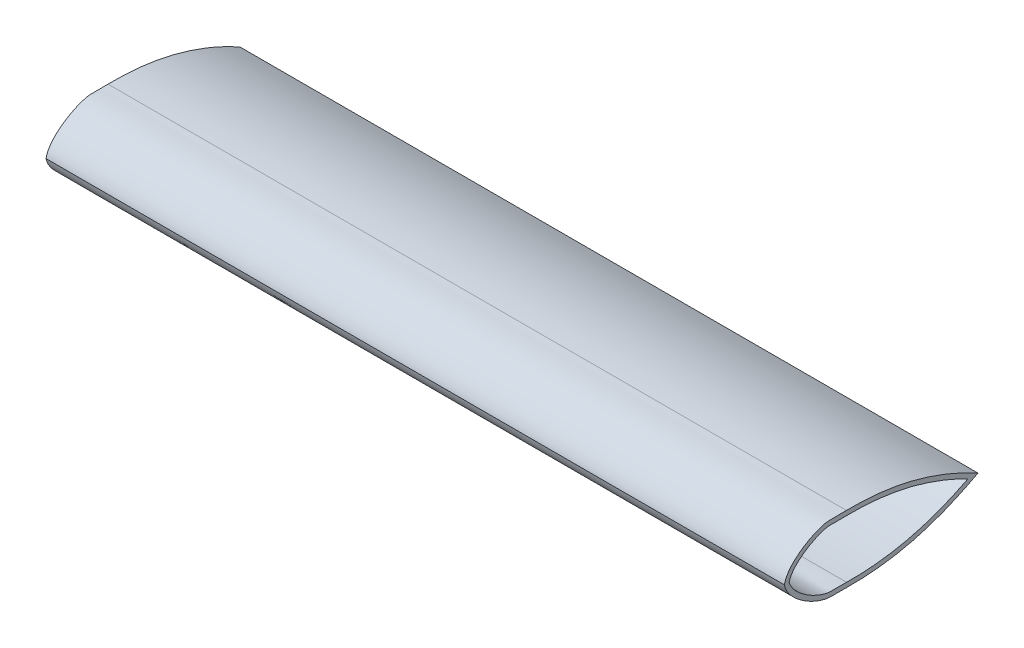
ISO-10303-21;
HEADER;
FILE_DESCRIPTION(('STEP AP214'),'2;1');
FILE_NAME('part.step','',(''),(''),'','','');
FILE_SCHEMA(('AUTOMOTIVE_DESIGN { 1 0 10303 214 1 1 1 1 }'));
ENDSEC;
DATA;
#1=APPLICATION_CONTEXT('core data for automotive mechanical design processes');
#2=APPLICATION_PROTOCOL_DEFINITION('international standard','automotive_design',2000,#1);
#3=PRODUCT_CONTEXT('',#1,'mechanical');
#4=PRODUCT('Part','Part','',(#3));
#5=PRODUCT_RELATED_PRODUCT_CATEGORY('part','',(#4));
#6=PRODUCT_DEFINITION_FORMATION('','',#4);
#7=PRODUCT_DEFINITION_CONTEXT('part definition',#1,'design');
#8=PRODUCT_DEFINITION('design','',#6,#7);
#9=PRODUCT_DEFINITION_SHAPE('','',#8);
#10=(LENGTH_UNIT() NAMED_UNIT(*) SI_UNIT(.MILLI.,.METRE.));
#11=(NAMED_UNIT(*) PLANE_ANGLE_UNIT() SI_UNIT($,.RADIAN.));
#12=(NAMED_UNIT(*) SI_UNIT($,.STERADIAN.) SOLID_ANGLE_UNIT());
#13=UNCERTAINTY_MEASURE_WITH_UNIT(LENGTH_MEASURE(1.E-05),#10,'distance_accuracy_value','');
#14=(GEOMETRIC_REPRESENTATION_CONTEXT(3) GLOBAL_UNCERTAINTY_ASSIGNED_CONTEXT((#13)) GLOBAL_UNIT_ASSIGNED_CONTEXT((#10,
#11,#12)) REPRESENTATION_CONTEXT('',''));
#15=CARTESIAN_POINT('',(0.,0.,0.));
#16=DIRECTION('',(0.,0.,1.));
#17=DIRECTION('',(1.,0.,0.));
#18=AXIS2_PLACEMENT_3D('',#15,#16,#17);
#19=CARTESIAN_POINT('',(115.52535704593,9.20715614920474,0.0324189138582137));
#20=CARTESIAN_POINT('',(115.52535704593,9.2545678789651,-3.12152695135503));
#21=CARTESIAN_POINT('',(115.52535704593,9.11059405651158,-6.26810860237046));
#22=CARTESIAN_POINT('',(115.52535704593,8.56973641400707,-10.9681085023738));
#23=CARTESIAN_POINT('',(115.52535704593,8.3362750127582,-12.5252170595591));
#24=CARTESIAN_POINT('',(115.52535704593,7.76137535616035,-15.6200257885337));
#25=CARTESIAN_POINT('',(115.52535704593,7.41957392528799,-17.1590894187303));
#26=CARTESIAN_POINT('',(115.52535704593,6.23425482299172,-21.7380864808638));
#27=CARTESIAN_POINT('',(115.52535704593,5.23448895790792,-24.724357096829));
#28=CARTESIAN_POINT('',(115.52535704593,3.45107168212743,-29.1057516055093));
#29=CARTESIAN_POINT('',(115.52535704593,2.8115402581163,-30.5449777205745));
#30=CARTESIAN_POINT('',(115.52535704593,1.79028170997367,-32.6746111586601));
#31=CARTESIAN_POINT('',(115.52535704593,1.43867214479019,-33.3792145014387));
#32=CARTESIAN_POINT('',(115.52535704593,0.719336072395416,-34.7808244083903));
#33=CARTESIAN_POINT('',(115.52535704593,0.359668036198039,-35.4816293618661));
#34=CARTESIAN_POINT('',(115.52535704593,6.57637818214127E-13,-36.1824343153419));
#35=B_SPLINE_CURVE_WITH_KNOTS('',3,(#19,#20,#21,#22,#23,#24,#25,#26,#27,#28,#29,#30,#31,#32,#33,
#34),.UNSPECIFIED.,.F.,.F.,(4,2,2,2,2,2,2,4),(0.,0.25,0.375,0.5,0.75,0.875,0.9375,1.),.UNSPECIFIED.);
#36=DIRECTION('',(-1.,0.,0.));
#37=VECTOR('',#36,1.);
#38=SURFACE_OF_LINEAR_EXTRUSION('',#35,#37);
#39=CARTESIAN_POINT('',(-87.67464295407,9.20715614920474,0.0324189138583322));
#40=CARTESIAN_POINT('',(-87.67464295407,9.25456787896511,-3.12152695135491));
#41=CARTESIAN_POINT('',(-87.67464295407,9.11059405651159,-6.26810860237034));
#42=CARTESIAN_POINT('',(-87.67464295407,8.56973641400708,-10.9681085023737));
#43=CARTESIAN_POINT('',(-87.67464295407,8.33627501275821,-12.525217059559));
#44=CARTESIAN_POINT('',(-87.67464295407,7.76137535616036,-15.6200257885336));
#45=CARTESIAN_POINT('',(-87.67464295407,7.419573925288,-17.1590894187302));
#46=CARTESIAN_POINT('',(-87.67464295407,6.23425482299173,-21.7380864808636));
#47=CARTESIAN_POINT('',(-87.67464295407,5.23448895790793,-24.7243570968289));
#48=CARTESIAN_POINT('',(-87.67464295407,3.45107168212744,-29.1057516055091));
#49=CARTESIAN_POINT('',(-87.67464295407,2.81154025811631,-30.5449777205744));
#50=CARTESIAN_POINT('',(-87.67464295407,1.79028170997367,-32.6746111586599));
#51=CARTESIAN_POINT('',(-87.67464295407,1.4386721447902,-33.3792145014386));
#52=CARTESIAN_POINT('',(-87.67464295407,0.719336072395424,-34.7808244083902));
#53=CARTESIAN_POINT('',(-87.67464295407,0.359668036198047,-35.481629361866));
#54=CARTESIAN_POINT('',(-87.6746429540701,6.66097717661771E-13,-36.1824343153418));
#55=B_SPLINE_CURVE_WITH_KNOTS('',3,(#39,#40,#41,#42,#43,#44,#45,#46,#47,#48,#49,#50,#51,#52,#53,
#54),.UNSPECIFIED.,.F.,.F.,(4,2,2,2,2,2,2,4),(0.,0.25,0.375,0.5,0.75,0.875,0.9375,1.),.UNSPECIFIED.);
#56=CARTESIAN_POINT('',(-87.67464295407,9.20715614920474,0.0324189138583322));
#57=VERTEX_POINT('',#56);
#58=CARTESIAN_POINT('',(-87.6746429540701,6.66097717661771E-13,-36.1824343153418));
#59=VERTEX_POINT('',#58);
#60=EDGE_CURVE('E250',#57,#59,#55,.T.);
#61=ORIENTED_EDGE('',*,*,#60,.F.);
#62=DIRECTION('',(-1.,0.,0.));
#63=VECTOR('',#62,1.);
#64=CARTESIAN_POINT('',(115.52535704593,9.20715614920474,0.0324189138582137));
#65=LINE('',#64,#63);
#66=CARTESIAN_POINT('',(115.52535704593,9.20715614920474,0.0324189138582137));
#67=VERTEX_POINT('',#66);
#68=EDGE_CURVE('E14',#67,#57,#65,.T.);
#69=ORIENTED_EDGE('',*,*,#68,.F.);
#70=CARTESIAN_POINT('',(115.52535704593,6.57637818214127E-13,-36.1824343153419));
#71=VERTEX_POINT('',#70);
#72=EDGE_CURVE('E286',#67,#71,#35,.T.);
#73=ORIENTED_EDGE('',*,*,#72,.T.);
#74=DIRECTION('',(-1.,0.,0.));
#75=VECTOR('',#74,1.);
#76=CARTESIAN_POINT('',(115.52535704593,6.57637818214127E-13,-36.1824343153419));
#77=LINE('',#76,#75);
#78=EDGE_CURVE('E118',#71,#59,#77,.T.);
#79=ORIENTED_EDGE('',*,*,#78,.T.);
#80=EDGE_LOOP('',(#61,#69,#73,#79));
#81=FACE_BOUND('',#80,.T.);
#82=ADVANCED_FACE('F114',(#81),#38,.T.);
#83=CARTESIAN_POINT('',(115.52535704593,-2.70601871759338E-13,17.1020945624622));
#84=CARTESIAN_POINT('',(115.52535704593,0.213797016089667,17.0473970201368));
#85=CARTESIAN_POINT('',(115.52535704593,0.428807060053155,16.9953368193116));
#86=CARTESIAN_POINT('',(115.52535704593,0.845636752605474,16.8625381177768));
#87=CARTESIAN_POINT('',(115.52535704593,1.04900235125496,16.7851607914813));
#88=CARTESIAN_POINT('',(115.52535704593,1.64604130883233,16.5246387155574));
#89=CARTESIAN_POINT('',(115.52535704593,2.02675755334856,16.3133228609559));
#90=CARTESIAN_POINT('',(115.52535704593,2.57750067721146,15.9521452879863));
#91=CARTESIAN_POINT('',(115.52535704593,2.75829823647482,15.8237992660147));
#92=CARTESIAN_POINT('',(115.52535704593,3.10889431206553,15.557478820278));
#93=CARTESIAN_POINT('',(115.52535704593,3.27912106073891,15.4192966055391));
#94=CARTESIAN_POINT('',(115.52535704593,3.77673202343123,14.9918077225645));
#95=CARTESIAN_POINT('',(115.52535704593,4.09116225350915,14.6896729941496));
#96=CARTESIAN_POINT('',(115.52535704593,4.69287297619096,14.0585177184276));
#97=CARTESIAN_POINT('',(115.52535704593,4.98009640397582,13.7294406610201));
#98=CARTESIAN_POINT('',(115.52535704593,5.53157218241393,13.0485387675165));
#99=CARTESIAN_POINT('',(115.52535704593,5.79630297980022,12.6958308387991));
#100=CARTESIAN_POINT('',(115.52535704593,6.54982361859307,11.6213864838288));
#101=CARTESIAN_POINT('',(115.52535704593,7.00253711647303,10.8796929174819));
#102=CARTESIAN_POINT('',(115.52535704593,7.81841743961151,9.35048507838553));
#103=CARTESIAN_POINT('',(115.52535704593,8.18245890481764,8.56341835571321));
#104=CARTESIAN_POINT('',(115.52535704593,8.64037140527623,7.3377123924627));
#105=CARTESIAN_POINT('',(115.52535704593,8.77848875807355,6.92013183843151));
#106=CARTESIAN_POINT('',(115.52535704593,9.00908377803576,6.06836294532955));
#107=CARTESIAN_POINT('',(115.52535704593,9.10010942656302,5.64121764824234));
#108=CARTESIAN_POINT('',(115.52535704593,9.20377313957187,4.78285505375745));
#109=CARTESIAN_POINT('',(115.52535704593,9.21179223365159,4.35139781467589));
#110=CARTESIAN_POINT('',(115.52535704593,9.19895632193267,3.4869834134688));
#111=CARTESIAN_POINT('',(115.52535704593,9.18910595575574,3.05459790942539));
#112=CARTESIAN_POINT('',(115.52535704593,9.17225102320762,1.75810092510754));
#113=CARTESIAN_POINT('',(115.52535704593,9.1760845525975,0.894552451460245));
#114=CARTESIAN_POINT('',(115.52535704593,9.20715614920474,0.0324189138582073));
#115=B_SPLINE_CURVE_WITH_KNOTS('',3,(#83,#84,#85,#86,#87,#88,#89,#90,#91,#92,#93,#94,#95,#96,
#97,#98,#99,#100,#101,#102,#103,#104,#105,#106,#107,#108,#109,#110,#111,#112,#113,#114),
.UNSPECIFIED.,.F.,.F.,(4,2,2,2,2,2,2,2,2,2,2,2,2,2,2,4),(0.,0.0312499999999999,
0.0624999999999998,0.125,0.15625,0.1875,0.25,0.3125,0.375,0.5,0.625,0.6875,0.75,0.8125,0.875,
1.),.UNSPECIFIED.);
#116=DIRECTION('',(-1.,0.,0.));
#117=VECTOR('',#116,1.);
#118=SURFACE_OF_LINEAR_EXTRUSION('',#115,#117);
#119=CARTESIAN_POINT('',(-87.67464295407,-2.62141972311694E-13,17.1020945624623));
#120=CARTESIAN_POINT('',(-87.67464295407,0.213797016089675,17.0473970201369));
#121=CARTESIAN_POINT('',(-87.67464295407,0.428807060053163,16.9953368193117));
#122=CARTESIAN_POINT('',(-87.67464295407,0.845636752605483,16.8625381177769));
#123=CARTESIAN_POINT('',(-87.67464295407,1.04900235125496,16.7851607914814));
#124=CARTESIAN_POINT('',(-87.67464295407,1.64604130883234,16.5246387155575));
#125=CARTESIAN_POINT('',(-87.67464295407,2.02675755334857,16.3133228609561));
#126=CARTESIAN_POINT('',(-87.67464295407,2.57750067721147,15.9521452879864));
#127=CARTESIAN_POINT('',(-87.67464295407,2.75829823647483,15.8237992660148));
#128=CARTESIAN_POINT('',(-87.67464295407,3.10889431206554,15.5574788202782));
#129=CARTESIAN_POINT('',(-87.67464295407,3.27912106073892,15.4192966055392));
#130=CARTESIAN_POINT('',(-87.67464295407,3.77673202343124,14.9918077225646));
#131=CARTESIAN_POINT('',(-87.67464295407,4.09116225350916,14.6896729941497));
#132=CARTESIAN_POINT('',(-87.67464295407,4.69287297619097,14.0585177184277));
#133=CARTESIAN_POINT('',(-87.67464295407,4.98009640397582,13.7294406610202));
#134=CARTESIAN_POINT('',(-87.67464295407,5.53157218241394,13.0485387675166));
#135=CARTESIAN_POINT('',(-87.67464295407,5.79630297980023,12.6958308387992));
#136=CARTESIAN_POINT('',(-87.67464295407,6.54982361859308,11.6213864838289));
#137=CARTESIAN_POINT('',(-87.67464295407,7.00253711647304,10.8796929174821));
#138=CARTESIAN_POINT('',(-87.67464295407,7.81841743961152,9.35048507838565));
#139=CARTESIAN_POINT('',(-87.67464295407,8.18245890481765,8.56341835571333));
#140=CARTESIAN_POINT('',(-87.67464295407,8.64037140527624,7.33771239246282));
#141=CARTESIAN_POINT('',(-87.67464295407,8.77848875807356,6.92013183843162));
#142=CARTESIAN_POINT('',(-87.67464295407,9.00908377803576,6.06836294532967));
#143=CARTESIAN_POINT('',(-87.67464295407,9.10010942656303,5.64121764824245));
#144=CARTESIAN_POINT('',(-87.67464295407,9.20377313957188,4.78285505375757));
#145=CARTESIAN_POINT('',(-87.67464295407,9.21179223365159,4.351397814676));
#146=CARTESIAN_POINT('',(-87.67464295407,9.19895632193268,3.48698341346892));
#147=CARTESIAN_POINT('',(-87.67464295407,9.18910595575575,3.05459790942551));
#148=CARTESIAN_POINT('',(-87.67464295407,9.17225102320762,1.75810092510765));
#149=CARTESIAN_POINT('',(-87.67464295407,9.17608455259751,0.894552451460364));
#150=CARTESIAN_POINT('',(-87.67464295407,9.20715614920474,0.0324189138583257));
#151=B_SPLINE_CURVE_WITH_KNOTS('',3,(#119,#120,#121,#122,#123,#124,#125,#126,#127,#128,#129,
#130,#131,#132,#133,#134,#135,#136,#137,#138,#139,#140,#141,#142,#143,#144,#145,#146,#147,#148,
#149,#150),.UNSPECIFIED.,.F.,.F.,(4,2,2,2,2,2,2,2,2,2,2,2,2,2,2,4),(0.,0.0312499999999999,
0.0624999999999998,0.125,0.15625,0.1875,0.25,0.3125,0.375,0.5,0.625,0.6875,0.75,0.8125,0.875,
1.),.UNSPECIFIED.);
#152=CARTESIAN_POINT('',(-87.6746429540701,-2.62141972311694E-13,17.1020945624623));
#153=VERTEX_POINT('',#152);
#154=EDGE_CURVE('E278',#153,#57,#151,.T.);
#155=ORIENTED_EDGE('',*,*,#154,.F.);
#156=DIRECTION('',(-1.,0.,0.));
#157=VECTOR('',#156,1.);
#158=CARTESIAN_POINT('',(115.52535704593,-2.70601871759338E-13,17.1020945624622));
#159=LINE('',#158,#157);
#160=CARTESIAN_POINT('',(115.52535704593,-2.70601871759338E-13,17.1020945624622));
#161=VERTEX_POINT('',#160);
#162=EDGE_CURVE('E124',#161,#153,#159,.T.);
#163=ORIENTED_EDGE('',*,*,#162,.F.);
#164=EDGE_CURVE('E238',#161,#67,#115,.T.);
#165=ORIENTED_EDGE('',*,*,#164,.T.);
#166=ORIENTED_EDGE('',*,*,#68,.T.);
#167=EDGE_LOOP('',(#155,#163,#165,#166));
#168=FACE_BOUND('',#167,.T.);
#169=ADVANCED_FACE('F231',(#168),#118,.T.);
#170=CARTESIAN_POINT('',(115.52535704593,-9.20715614920441,0.0324189138581248));
#171=CARTESIAN_POINT('',(115.52535704593,-9.17568947588769,0.905514517087841));
#172=CARTESIAN_POINT('',(115.52535704593,-9.17223382694292,1.77912563537704));
#173=CARTESIAN_POINT('',(115.52535704593,-9.18971872879831,3.08995950172446));
#174=CARTESIAN_POINT('',(115.52535704593,-9.2002237592525,3.52699019440411));
#175=CARTESIAN_POINT('',(115.52535704593,-9.21178350797821,4.40087765616154));
#176=CARTESIAN_POINT('',(115.52535704593,-9.20070239747973,4.83751107737431));
#177=CARTESIAN_POINT('',(115.52535704593,-9.11606067068707,5.49120936758469));
#178=CARTESIAN_POINT('',(115.52535704593,-9.07754563261173,5.70915611083955));
#179=CARTESIAN_POINT('',(115.52535704593,-8.98673912995048,6.13723348220492));
#180=CARTESIAN_POINT('',(115.52535704593,-8.93429324667089,6.34850294555809));
#181=CARTESIAN_POINT('',(115.52535704593,-8.76071827502881,6.9759266836234));
#182=CARTESIAN_POINT('',(115.52535704593,-8.6236194532456,7.38580152435276));
#183=CARTESIAN_POINT('',(115.52535704593,-8.16704583868344,8.59762268928325));
#184=CARTESIAN_POINT('',(115.52535704593,-7.80320360130309,9.38212335975797));
#185=CARTESIAN_POINT('',(115.52535704593,-7.18749020450821,10.5313694190034));
#186=CARTESIAN_POINT('',(115.52535704593,-6.96955373944441,10.9105872648037));
#187=CARTESIAN_POINT('',(115.52535704593,-6.51357123522559,11.6516983541814));
#188=CARTESIAN_POINT('',(115.52535704593,-6.27522365782646,12.0142783221228));
#189=CARTESIAN_POINT('',(115.52535704593,-5.52722885875345,13.0766412962924));
#190=CARTESIAN_POINT('',(115.52535704593,-4.98589787049965,13.7520241118218));
#191=CARTESIAN_POINT('',(115.52535704593,-4.08448323345092,14.6962359408568));
#192=CARTESIAN_POINT('',(115.52535704593,-3.76712043798521,15.0006180270843));
#193=CARTESIAN_POINT('',(115.52535704593,-3.10556890090362,15.5678244218202));
#194=CARTESIAN_POINT('',(115.52535704593,-2.76082512459078,15.831634309525));
#195=CARTESIAN_POINT('',(115.52535704593,-2.21661508263406,16.188955161605));
#196=CARTESIAN_POINT('',(115.52535704593,-2.03066602099421,16.3016206259631));
#197=CARTESIAN_POINT('',(115.52535704593,-1.64813078644225,16.5118782786066));
#198=CARTESIAN_POINT('',(115.52535704593,-1.45061194113076,16.6098639219749));
#199=CARTESIAN_POINT('',(115.52535704593,-1.04808859285852,16.7856109231705));
#200=CARTESIAN_POINT('',(115.52535704593,-0.843382437491732,16.8633535259416));
#201=CARTESIAN_POINT('',(115.52535704593,-0.426225712136378,16.9960608825114));
#202=CARTESIAN_POINT('',(115.52535704593,-0.212641898615674,17.0476925438448));
#203=CARTESIAN_POINT('',(115.52535704593,-2.7513460645072E-13,17.1020945624622));
#204=B_SPLINE_CURVE_WITH_KNOTS('',3,(#170,#171,#172,#173,#174,#175,#176,#177,#178,#179,#180,
#181,#182,#183,#184,#185,#186,#187,#188,#189,#190,#191,#192,#193,#194,#195,#196,#197,#198,#199,
#200,#201,#202,#203),.UNSPECIFIED.,.F.,.F.,(4,2,2,2,2,2,2,2,2,2,2,2,2,2,2,2,4),(0.,0.125,0.1875,
0.249999999999999,0.281249999999999,0.3125,0.375,0.5,0.5625,0.625,0.75,0.812499999999999,
0.874999999999999,0.90625,0.9375,0.96875,1.),.UNSPECIFIED.);
#205=DIRECTION('',(-1.,0.,0.));
#206=VECTOR('',#205,1.);
#207=SURFACE_OF_LINEAR_EXTRUSION('',#204,#206);
#208=CARTESIAN_POINT('',(-87.67464295407,-9.2071561492044,0.0324189138582432));
#209=CARTESIAN_POINT('',(-87.67464295407,-9.17568947588769,0.905514517087959));
#210=CARTESIAN_POINT('',(-87.67464295407,-9.17223382694291,1.77912563537715));
#211=CARTESIAN_POINT('',(-87.67464295407,-9.1897187287983,3.08995950172458));
#212=CARTESIAN_POINT('',(-87.67464295407,-9.20022375925249,3.52699019440423));
#213=CARTESIAN_POINT('',(-87.67464295407,-9.2117835079782,4.40087765616165));
#214=CARTESIAN_POINT('',(-87.67464295407,-9.20070239747972,4.83751107737443));
#215=CARTESIAN_POINT('',(-87.67464295407,-9.11606067068707,5.4912093675848));
#216=CARTESIAN_POINT('',(-87.67464295407,-9.07754563261173,5.70915611083967));
#217=CARTESIAN_POINT('',(-87.67464295407,-8.98673912995047,6.13723348220504));
#218=CARTESIAN_POINT('',(-87.67464295407,-8.93429324667088,6.34850294555821));
#219=CARTESIAN_POINT('',(-87.67464295407,-8.7607182750288,6.97592668362352));
#220=CARTESIAN_POINT('',(-87.67464295407,-8.62361945324559,7.38580152435288));
#221=CARTESIAN_POINT('',(-87.67464295407,-8.16704583868343,8.59762268928337));
#222=CARTESIAN_POINT('',(-87.67464295407,-7.80320360130308,9.38212335975809));
#223=CARTESIAN_POINT('',(-87.67464295407,-7.1874902045082,10.5313694190035));
#224=CARTESIAN_POINT('',(-87.67464295407,-6.9695537394444,10.9105872648038));
#225=CARTESIAN_POINT('',(-87.67464295407,-6.51357123522558,11.6516983541815));
#226=CARTESIAN_POINT('',(-87.67464295407,-6.27522365782645,12.0142783221229));
#227=CARTESIAN_POINT('',(-87.67464295407,-5.52722885875344,13.0766412962925));
#228=CARTESIAN_POINT('',(-87.67464295407,-4.98589787049965,13.7520241118219));
#229=CARTESIAN_POINT('',(-87.67464295407,-4.08448323345091,14.6962359408569));
#230=CARTESIAN_POINT('',(-87.67464295407,-3.76712043798521,15.0006180270844));
#231=CARTESIAN_POINT('',(-87.67464295407,-3.10556890090361,15.5678244218204));
#232=CARTESIAN_POINT('',(-87.67464295407,-2.76082512459077,15.8316343095251));
#233=CARTESIAN_POINT('',(-87.67464295407,-2.21661508263405,16.1889551616051));
#234=CARTESIAN_POINT('',(-87.67464295407,-2.03066602099421,16.3016206259633));
#235=CARTESIAN_POINT('',(-87.67464295407,-1.64813078644224,16.5118782786067));
#236=CARTESIAN_POINT('',(-87.67464295407,-1.45061194113075,16.609863921975));
#237=CARTESIAN_POINT('',(-87.67464295407,-1.04808859285851,16.7856109231706));
#238=CARTESIAN_POINT('',(-87.67464295407,-0.843382437491724,16.8633535259417));
#239=CARTESIAN_POINT('',(-87.67464295407,-0.42622571213637,16.9960608825115));
#240=CARTESIAN_POINT('',(-87.67464295407,-0.212641898615666,17.0476925438449));
#241=CARTESIAN_POINT('',(-87.67464295407,-2.66674707003076E-13,17.1020945624623));
#242=B_SPLINE_CURVE_WITH_KNOTS('',3,(#208,#209,#210,#211,#212,#213,#214,#215,#216,#217,#218,
#219,#220,#221,#222,#223,#224,#225,#226,#227,#228,#229,#230,#231,#232,#233,#234,#235,#236,#237,
#238,#239,#240,#241),.UNSPECIFIED.,.F.,.F.,(4,2,2,2,2,2,2,2,2,2,2,2,2,2,2,2,4),(0.,0.125,0.1875,
0.249999999999999,0.281249999999999,0.3125,0.375,0.5,0.5625,0.625,0.75,0.812499999999999,
0.874999999999999,0.90625,0.9375,0.96875,1.),.UNSPECIFIED.);
#243=CARTESIAN_POINT('',(-87.6746429540701,-9.2071561492044,0.0324189138582432));
#244=VERTEX_POINT('',#243);
#245=EDGE_CURVE('E269',#244,#153,#242,.T.);
#246=ORIENTED_EDGE('',*,*,#245,.F.);
#247=DIRECTION('',(-1.,0.,0.));
#248=VECTOR('',#247,1.);
#249=CARTESIAN_POINT('',(115.52535704593,-9.20715614920441,0.0324189138581248));
#250=LINE('',#249,#248);
#251=CARTESIAN_POINT('',(115.52535704593,-9.20715614920441,0.0324189138581248));
#252=VERTEX_POINT('',#251);
#253=EDGE_CURVE('E292',#252,#244,#250,.T.);
#254=ORIENTED_EDGE('',*,*,#253,.F.);
#255=EDGE_CURVE('E245',#252,#161,#204,.T.);
#256=ORIENTED_EDGE('',*,*,#255,.T.);
#257=ORIENTED_EDGE('',*,*,#162,.T.);
#258=EDGE_LOOP('',(#246,#254,#256,#257));
#259=FACE_BOUND('',#258,.T.);
#260=ADVANCED_FACE('F235',(#259),#207,.T.);
#261=CARTESIAN_POINT('',(115.52535704593,6.57637818214127E-13,-36.1824343153419));
#262=CARTESIAN_POINT('',(115.52535704593,-0.359723472093304,-35.4815213462879));
#263=CARTESIAN_POINT('',(115.52535704593,-0.71944694418726,-34.7806083772339));
#264=CARTESIAN_POINT('',(115.52535704593,-1.43889388837518,-33.3787824391259));
#265=CARTESIAN_POINT('',(115.52535704593,-1.79056585666944,-32.6740374275051));
#266=CARTESIAN_POINT('',(115.52535704593,-2.81206322700419,-30.5438495403112));
#267=CARTESIAN_POINT('',(115.52535704593,-3.45204899547116,-29.1034908226069));
#268=CARTESIAN_POINT('',(115.52535704593,-4.64093627892337,-26.1824219077136));
#269=CARTESIAN_POINT('',(115.52535704593,-5.1881556899537,-24.7058751017734));
#270=CARTESIAN_POINT('',(115.52535704593,-6.18284167851505,-21.7189582362439));
#271=CARTESIAN_POINT('',(115.52535704593,-6.6306563442391,-20.2071836306956));
#272=CARTESIAN_POINT('',(115.52535704593,-7.81562489543864,-15.628240432795));
#273=CARTESIAN_POINT('',(115.52535704593,-8.38992897514506,-12.5317304247944));
#274=CARTESIAN_POINT('',(115.52535704593,-9.11075462961609,-6.26559934802886));
#275=CARTESIAN_POINT('',(115.52535704593,-9.25456706456247,-3.12147277529385));
#276=CARTESIAN_POINT('',(115.52535704593,-9.20715614920441,0.0324189138581248));
#277=B_SPLINE_CURVE_WITH_KNOTS('',3,(#261,#262,#263,#264,#265,#266,#267,#268,#269,#270,#271,
#272,#273,#274,#275,#276),.UNSPECIFIED.,.F.,.F.,(4,2,2,2,2,2,2,4),(0.,0.0625,0.125,0.25,0.375,
0.5,0.75,1.),.UNSPECIFIED.);
#278=DIRECTION('',(-1.,0.,0.));
#279=VECTOR('',#278,1.);
#280=SURFACE_OF_LINEAR_EXTRUSION('',#277,#279);
#281=CARTESIAN_POINT('',(-87.6746429540701,6.66097717661771E-13,-36.1824343153418));
#282=CARTESIAN_POINT('',(-87.67464295407,-0.359723472093295,-35.4815213462878));
#283=CARTESIAN_POINT('',(-87.67464295407,-0.719446944187251,-34.7806083772338));
#284=CARTESIAN_POINT('',(-87.67464295407,-1.43889388837517,-33.3787824391258));
#285=CARTESIAN_POINT('',(-87.67464295407,-1.79056585666943,-32.674037427505));
#286=CARTESIAN_POINT('',(-87.67464295407,-2.81206322700418,-30.543849540311));
#287=CARTESIAN_POINT('',(-87.67464295407,-3.45204899547115,-29.1034908226068));
#288=CARTESIAN_POINT('',(-87.67464295407,-4.64093627892336,-26.1824219077135));
#289=CARTESIAN_POINT('',(-87.67464295407,-5.1881556899537,-24.7058751017733));
#290=CARTESIAN_POINT('',(-87.67464295407,-6.18284167851504,-21.7189582362438));
#291=CARTESIAN_POINT('',(-87.67464295407,-6.63065634423909,-20.2071836306955));
#292=CARTESIAN_POINT('',(-87.67464295407,-7.81562489543863,-15.6282404327949));
#293=CARTESIAN_POINT('',(-87.67464295407,-8.38992897514505,-12.5317304247943));
#294=CARTESIAN_POINT('',(-87.67464295407,-9.11075462961608,-6.26559934802874));
#295=CARTESIAN_POINT('',(-87.67464295407,-9.25456706456246,-3.12147277529374));
#296=CARTESIAN_POINT('',(-87.67464295407,-9.2071561492044,0.0324189138582432));
#297=B_SPLINE_CURVE_WITH_KNOTS('',3,(#281,#282,#283,#284,#285,#286,#287,#288,#289,#290,#291,
#292,#293,#294,#295,#296),.UNSPECIFIED.,.F.,.F.,(4,2,2,2,2,2,2,4),(0.,0.0625,0.125,0.25,0.375,
0.5,0.75,1.),.UNSPECIFIED.);
#298=EDGE_CURVE('E259',#59,#244,#297,.T.);
#299=ORIENTED_EDGE('',*,*,#298,.F.);
#300=ORIENTED_EDGE('',*,*,#78,.F.);
#301=EDGE_CURVE('E309',#71,#252,#277,.T.);
#302=ORIENTED_EDGE('',*,*,#301,.T.);
#303=ORIENTED_EDGE('',*,*,#253,.T.);
#304=EDGE_LOOP('',(#299,#300,#302,#303));
#305=FACE_BOUND('',#304,.T.);
#306=ADVANCED_FACE('F227',(#305),#280,.T.);
#307=CARTESIAN_POINT('',(115.52535704593,7.0244675578559,-18.6854217727748));
#308=DIRECTION('',(1.,0.,0.));
#309=DIRECTION('',(0.,0.,-1.));
#310=AXIS2_PLACEMENT_3D('',#307,#308,#309);
#311=PLANE('',#310);
#312=CARTESIAN_POINT('',(115.52535704593,7.93750000000017,0.));
#313=CARTESIAN_POINT('',(115.52535704593,8.11760063281946,-11.9807408224442));
#314=CARTESIAN_POINT('',(115.52535704593,5.46629021684272,-22.7500583661511));
#315=CARTESIAN_POINT('',(115.52535704593,5.88465719609552E-13,-33.4009999999999));
#316=B_SPLINE_CURVE_WITH_KNOTS('',3,(#312,#313,#314,#315),.UNSPECIFIED.,.F.,.F.,(4,4),(0.,1.),.UNSPECIFIED.);
#317=CARTESIAN_POINT('',(115.52535704593,7.93750000000017,0.));
#318=VERTEX_POINT('',#317);
#319=CARTESIAN_POINT('',(115.52535704593,5.88465719609552E-13,-33.4009999999999));
#320=VERTEX_POINT('',#319);
#321=EDGE_CURVE('E183',#318,#320,#316,.T.);
#322=ORIENTED_EDGE('',*,*,#321,.T.);
#323=CARTESIAN_POINT('',(115.52535704593,5.88465719609552E-13,-33.4009999999999));
#324=CARTESIAN_POINT('',(115.52535704593,-5.46629021684193,-22.7500583661517));
#325=CARTESIAN_POINT('',(115.52535704593,-8.11760063281913,-11.9807408224442));
#326=CARTESIAN_POINT('',(115.52535704593,-7.93749999999984,0.));
#327=B_SPLINE_CURVE_WITH_KNOTS('',3,(#323,#324,#325,#326),.UNSPECIFIED.,.F.,.F.,(4,4),(0.,1.),.UNSPECIFIED.);
#328=CARTESIAN_POINT('',(115.52535704593,-7.93749999999984,0.));
#329=VERTEX_POINT('',#328);
#330=EDGE_CURVE('E193',#320,#329,#327,.T.);
#331=ORIENTED_EDGE('',*,*,#330,.T.);
#332=CARTESIAN_POINT('',(115.52535704593,-7.93749999999984,0.));
#333=CARTESIAN_POINT('',(115.52535704593,-7.88451384743213,1.47018963121067));
#334=CARTESIAN_POINT('',(115.52535704593,-7.92593053810755,3.22927320691956));
#335=CARTESIAN_POINT('',(115.52535704593,-7.98902906903374,7.44161801849532));
#336=CARTESIAN_POINT('',(115.52535704593,-3.80414762291384,14.8179423282001));
#337=CARTESIAN_POINT('',(115.52535704593,-2.32875289705578E-13,15.7911903623485));
#338=B_SPLINE_CURVE_WITH_KNOTS('',3,(#332,#333,#334,#335,#336,#337),.UNSPECIFIED.,.F.,.F.,(4,1,
1,4),(0.,0.236691734828959,0.336691734828958,1.),.UNSPECIFIED.);
#339=CARTESIAN_POINT('',(115.52535704593,-3.17979223228994E-13,15.7911903623485));
#340=VERTEX_POINT('',#339);
#341=EDGE_CURVE('E132',#329,#340,#338,.T.);
#342=ORIENTED_EDGE('',*,*,#341,.T.);
#343=CARTESIAN_POINT('',(115.52535704593,-3.17979223228994E-13,15.7911903623485));
#344=CARTESIAN_POINT('',(115.52535704593,3.80414762291327,14.8179423282));
#345=CARTESIAN_POINT('',(115.52535704593,7.98902906903384,7.44161801849547));
#346=CARTESIAN_POINT('',(115.52535704593,7.92593053810732,3.22927320691989));
#347=CARTESIAN_POINT('',(115.52535704593,7.88451384743246,1.47018963121067));
#348=CARTESIAN_POINT('',(115.52535704593,7.93750000000017,0.));
#349=B_SPLINE_CURVE_WITH_KNOTS('',3,(#343,#344,#345,#346,#347,#348),.UNSPECIFIED.,.F.,.F.,(4,1,
1,4),(0.,0.663308265171042,0.763308265171041,1.),.UNSPECIFIED.);
#350=EDGE_CURVE('E190',#340,#318,#349,.T.);
#351=ORIENTED_EDGE('',*,*,#350,.T.);
#352=EDGE_LOOP('',(#322,#331,#342,#351));
#353=FACE_BOUND('',#352,.T.);
#354=ORIENTED_EDGE('',*,*,#72,.F.);
#355=ORIENTED_EDGE('',*,*,#164,.F.);
#356=ORIENTED_EDGE('',*,*,#255,.F.);
#357=ORIENTED_EDGE('',*,*,#301,.F.);
#358=EDGE_LOOP('',(#354,#355,#356,#357));
#359=FACE_BOUND('',#358,.T.);
#360=ADVANCED_FACE('F198',(#353,#359),#311,.T.);
#361=CARTESIAN_POINT('',(-87.67464295407,7.02446755785591,-18.6854217727747));
#362=DIRECTION('',(1.,0.,0.));
#363=DIRECTION('',(0.,0.,-1.));
#364=AXIS2_PLACEMENT_3D('',#361,#362,#363);
#365=PLANE('',#364);
#366=CARTESIAN_POINT('',(-87.67464295407,5.96925619057195E-13,-33.4009999999998));
#367=CARTESIAN_POINT('',(-87.67464295407,-5.46629021684192,-22.7500583661516));
#368=CARTESIAN_POINT('',(-87.67464295407,-8.11760063281912,-11.9807408224441));
#369=CARTESIAN_POINT('',(-87.67464295407,-7.93749999999983,0.));
#370=B_SPLINE_CURVE_WITH_KNOTS('',3,(#366,#367,#368,#369),.UNSPECIFIED.,.F.,.F.,(4,4),(0.,1.),.UNSPECIFIED.);
#371=CARTESIAN_POINT('',(-87.67464295407,5.96925619057195E-13,-33.4009999999998));
#372=VERTEX_POINT('',#371);
#373=CARTESIAN_POINT('',(-87.67464295407,-7.93749999999983,0.));
#374=VERTEX_POINT('',#373);
#375=EDGE_CURVE('E412',#372,#374,#370,.T.);
#376=ORIENTED_EDGE('',*,*,#375,.F.);
#377=CARTESIAN_POINT('',(-87.67464295407,7.93750000000017,0.));
#378=CARTESIAN_POINT('',(-87.67464295407,8.11760063281947,-11.9807408224441));
#379=CARTESIAN_POINT('',(-87.67464295407,5.46629021684273,-22.750058366151));
#380=CARTESIAN_POINT('',(-87.67464295407,5.96925619057195E-13,-33.4009999999998));
#381=B_SPLINE_CURVE_WITH_KNOTS('',3,(#377,#378,#379,#380),.UNSPECIFIED.,.F.,.F.,(4,4),(0.,1.),.UNSPECIFIED.);
#382=CARTESIAN_POINT('',(-87.67464295407,7.93750000000017,0.));
#383=VERTEX_POINT('',#382);
#384=EDGE_CURVE('E140',#383,#372,#381,.T.);
#385=ORIENTED_EDGE('',*,*,#384,.F.);
#386=CARTESIAN_POINT('',(-87.67464295407,-3.0951932378135E-13,15.7911903623486));
#387=CARTESIAN_POINT('',(-87.67464295407,3.80414762291328,14.8179423282001));
#388=CARTESIAN_POINT('',(-87.67464295407,7.98902906903385,7.44161801849558));
#389=CARTESIAN_POINT('',(-87.67464295407,7.92593053810733,3.22927320692001));
#390=CARTESIAN_POINT('',(-87.67464295407,7.88451384743247,1.47018963121079));
#391=CARTESIAN_POINT('',(-87.67464295407,7.93750000000017,0.));
#392=B_SPLINE_CURVE_WITH_KNOTS('',3,(#386,#387,#388,#389,#390,#391),.UNSPECIFIED.,.F.,.F.,(4,1,
1,4),(0.,0.663308265171042,0.763308265171041,1.),.UNSPECIFIED.);
#393=CARTESIAN_POINT('',(-87.67464295407,-3.0951932378135E-13,15.7911903623486));
#394=VERTEX_POINT('',#393);
#395=EDGE_CURVE('E202',#394,#383,#392,.T.);
#396=ORIENTED_EDGE('',*,*,#395,.F.);
#397=CARTESIAN_POINT('',(-87.67464295407,-7.93749999999983,0.));
#398=CARTESIAN_POINT('',(-87.67464295407,-7.88451384743212,1.47018963121079));
#399=CARTESIAN_POINT('',(-87.67464295407,-7.92593053810754,3.22927320691968));
#400=CARTESIAN_POINT('',(-87.67464295407,-7.98902906903373,7.44161801849544));
#401=CARTESIAN_POINT('',(-87.67464295407,-3.80414762291383,14.8179423282002));
#402=CARTESIAN_POINT('',(-87.67464295407,-2.24415390257935E-13,15.7911903623486));
#403=B_SPLINE_CURVE_WITH_KNOTS('',3,(#397,#398,#399,#400,#401,#402),.UNSPECIFIED.,.F.,.F.,(4,1,
1,4),(0.,0.236691734828959,0.336691734828958,1.),.UNSPECIFIED.);
#404=EDGE_CURVE('E206',#374,#394,#403,.T.);
#405=ORIENTED_EDGE('',*,*,#404,.F.);
#406=EDGE_LOOP('',(#376,#385,#396,#405));
#407=FACE_BOUND('',#406,.T.);
#408=ORIENTED_EDGE('',*,*,#60,.T.);
#409=ORIENTED_EDGE('',*,*,#298,.T.);
#410=ORIENTED_EDGE('',*,*,#245,.T.);
#411=ORIENTED_EDGE('',*,*,#154,.T.);
#412=EDGE_LOOP('',(#408,#409,#410,#411));
#413=FACE_BOUND('',#412,.T.);
#414=ADVANCED_FACE('F223',(#407,#413),#365,.F.);
#415=DIRECTION('',(-1.,0.,0.));
#416=VECTOR('',#415,1.);
#417=SURFACE_OF_LINEAR_EXTRUSION('',#316,#416);
#418=ORIENTED_EDGE('',*,*,#384,.T.);
#419=DIRECTION('',(-1.,0.,0.));
#420=VECTOR('',#419,1.);
#421=CARTESIAN_POINT('',(115.52535704593,5.88465719609552E-13,-33.4009999999999));
#422=LINE('',#421,#420);
#423=EDGE_CURVE('E179',#320,#372,#422,.T.);
#424=ORIENTED_EDGE('',*,*,#423,.F.);
#425=ORIENTED_EDGE('',*,*,#321,.F.);
#426=DIRECTION('',(-1.,0.,0.));
#427=VECTOR('',#426,1.);
#428=CARTESIAN_POINT('',(115.52535704593,7.93750000000017,0.));
#429=LINE('',#428,#427);
#430=EDGE_CURVE('E260',#318,#383,#429,.T.);
#431=ORIENTED_EDGE('',*,*,#430,.T.);
#432=EDGE_LOOP('',(#418,#424,#425,#431));
#433=FACE_BOUND('',#432,.T.);
#434=ADVANCED_FACE('F181',(#433),#417,.F.);
#435=DIRECTION('',(-1.,0.,0.));
#436=VECTOR('',#435,1.);
#437=SURFACE_OF_LINEAR_EXTRUSION('',#349,#436);
#438=ORIENTED_EDGE('',*,*,#395,.T.);
#439=ORIENTED_EDGE('',*,*,#430,.F.);
#440=ORIENTED_EDGE('',*,*,#350,.F.);
#441=DIRECTION('',(-1.,0.,0.));
#442=VECTOR('',#441,1.);
#443=CARTESIAN_POINT('',(115.52535704593,-3.17979223228994E-13,15.7911903623485));
#444=LINE('',#443,#442);
#445=EDGE_CURVE('E437',#340,#394,#444,.T.);
#446=ORIENTED_EDGE('',*,*,#445,.T.);
#447=EDGE_LOOP('',(#438,#439,#440,#446));
#448=FACE_BOUND('',#447,.T.);
#449=ADVANCED_FACE('F222',(#448),#437,.F.);
#450=DIRECTION('',(-1.,0.,0.));
#451=VECTOR('',#450,1.);
#452=SURFACE_OF_LINEAR_EXTRUSION('',#338,#451);
#453=ORIENTED_EDGE('',*,*,#404,.T.);
#454=ORIENTED_EDGE('',*,*,#445,.F.);
#455=ORIENTED_EDGE('',*,*,#341,.F.);
#456=DIRECTION('',(-1.,0.,0.));
#457=VECTOR('',#456,1.);
#458=CARTESIAN_POINT('',(115.52535704593,-7.93749999999984,0.));
#459=LINE('',#458,#457);
#460=EDGE_CURVE('E189',#329,#374,#459,.T.);
#461=ORIENTED_EDGE('',*,*,#460,.T.);
#462=EDGE_LOOP('',(#453,#454,#455,#461));
#463=FACE_BOUND('',#462,.T.);
#464=ADVANCED_FACE('F372',(#463),#452,.F.);
#465=DIRECTION('',(-1.,0.,0.));
#466=VECTOR('',#465,1.);
#467=SURFACE_OF_LINEAR_EXTRUSION('',#327,#466);
#468=ORIENTED_EDGE('',*,*,#375,.T.);
#469=ORIENTED_EDGE('',*,*,#460,.F.);
#470=ORIENTED_EDGE('',*,*,#330,.F.);
#471=ORIENTED_EDGE('',*,*,#423,.T.);
#472=EDGE_LOOP('',(#468,#469,#470,#471));
#473=FACE_BOUND('',#472,.T.);
#474=ADVANCED_FACE('F194',(#473),#467,.F.);
#475=CLOSED_SHELL('',(#82,#169,#260,#306,#360,#414,#434,#449,#464,#474));
#476=MANIFOLD_SOLID_BREP('B2',#475);
#477=CARTESIAN_POINT('',(165.510963462816,0.,0.));
#478=DIRECTION('',(-1.,0.,0.));
#479=DIRECTION('',(0.,0.,1.));
#480=AXIS2_PLACEMENT_3D('',#477,#478,#479);
#481=CYLINDRICAL_SURFACE('',#480,7.9375);
#482=CARTESIAN_POINT('',(98.6103231601427,0.,0.));
#483=DIRECTION('',(-1.,0.,0.));
#484=DIRECTION('',(0.,0.,1.));
#485=AXIS2_PLACEMENT_3D('',#482,#483,#484);
#486=CIRCLE('',#485,7.9375);
#487=CARTESIAN_POINT('',(98.6103231601427,0.,7.9375));
#488=VERTEX_POINT('',#487);
#489=EDGE_CURVE('E463',#488,#488,#486,.T.);
#490=ORIENTED_EDGE('',*,*,#489,.T.);
#491=EDGE_LOOP('',(#490));
#492=FACE_BOUND('',#491,.T.);
#493=CARTESIAN_POINT('',(-87.67464295407,-1.66136895907165E-13,2.27596413937547E-13));
#494=DIRECTION('',(1.,0.,0.));
#495=DIRECTION('',(0.,0.,-1.));
#496=AXIS2_PLACEMENT_3D('',#493,#494,#495);
#497=CIRCLE('',#496,7.9375);
#498=CARTESIAN_POINT('',(-87.67464295407,-1.66412283258976E-13,-7.93749999999977));
#499=VERTEX_POINT('',#498);
#500=EDGE_CURVE('E467',#499,#499,#497,.T.);
#501=ORIENTED_EDGE('',*,*,#500,.T.);
#502=EDGE_LOOP('',(#501));
#503=FACE_BOUND('',#502,.T.);
#504=ADVANCED_FACE('F456',(#492,#503),#481,.T.);
#505=CARTESIAN_POINT('',(165.510963462816,0.,0.));
#506=DIRECTION('',(-1.,0.,0.));
#507=DIRECTION('',(0.,0.,1.));
#508=AXIS2_PLACEMENT_3D('',#505,#506,#507);
#509=CYLINDRICAL_SURFACE('',#508,6.4643);
#510=CARTESIAN_POINT('',(98.6103231601427,0.,0.));
#511=DIRECTION('',(-1.,0.,0.));
#512=DIRECTION('',(0.,0.,1.));
#513=AXIS2_PLACEMENT_3D('',#510,#511,#512);
#514=CIRCLE('',#513,6.4643);
#515=CARTESIAN_POINT('',(98.6103231601427,0.,6.4643));
#516=VERTEX_POINT('',#515);
#517=EDGE_CURVE('E113',#516,#516,#514,.T.);
#518=ORIENTED_EDGE('',*,*,#517,.F.);
#519=EDGE_LOOP('',(#518));
#520=FACE_BOUND('',#519,.T.);
#521=CARTESIAN_POINT('',(-87.67464295407,-1.66136895907165E-13,2.27596413937547E-13));
#522=DIRECTION('',(1.,0.,0.));
#523=DIRECTION('',(0.,0.,-1.));
#524=AXIS2_PLACEMENT_3D('',#521,#522,#523);
#525=CIRCLE('',#524,6.4643);
#526=CARTESIAN_POINT('',(-87.67464295407,-1.6636117136648E-13,-6.46429999999977));
#527=VERTEX_POINT('',#526);
#528=EDGE_CURVE('E471',#527,#527,#525,.T.);
#529=ORIENTED_EDGE('',*,*,#528,.F.);
#530=EDGE_LOOP('',(#529));
#531=FACE_BOUND('',#530,.T.);
#532=ADVANCED_FACE('F480',(#520,#531),#509,.F.);
#533=CARTESIAN_POINT('',(98.6103231601427,-4.7625,2.1524775964989E-13));
#534=DIRECTION('',(-1.,0.,0.));
#535=DIRECTION('',(0.,0.,1.));
#536=AXIS2_PLACEMENT_3D('',#533,#534,#535);
#537=PLANE('',#536);
#538=ORIENTED_EDGE('',*,*,#517,.T.);
#539=EDGE_LOOP('',(#538));
#540=FACE_BOUND('',#539,.T.);
#541=ORIENTED_EDGE('',*,*,#489,.F.);
#542=EDGE_LOOP('',(#541));
#543=FACE_BOUND('',#542,.T.);
#544=ADVANCED_FACE('F458',(#540,#543),#537,.F.);
#545=CARTESIAN_POINT('',(-87.67464295407,-1.66136895907165E-13,2.27596413937547E-13));
#546=DIRECTION('',(1.,0.,0.));
#547=DIRECTION('',(0.,0.,-1.));
#548=AXIS2_PLACEMENT_3D('',#545,#546,#547);
#549=PLANE('',#548);
#550=ORIENTED_EDGE('',*,*,#528,.T.);
#551=EDGE_LOOP('',(#550));
#552=FACE_BOUND('',#551,.T.);
#553=ORIENTED_EDGE('',*,*,#500,.F.);
#554=EDGE_LOOP('',(#553));
#555=FACE_BOUND('',#554,.T.);
#556=ADVANCED_FACE('F477',(#552,#555),#549,.F.);
#557=CLOSED_SHELL('',(#504,#532,#544,#556));
#558=MANIFOLD_SOLID_BREP('B8_NOT_SHOWN',#557);
#559=ADVANCED_BREP_SHAPE_REPRESENTATION('',(#18,#476,#558),#14);
#560=SHAPE_DEFINITION_REPRESENTATION(#9,#559);
ENDSEC;
END-ISO-10303-21;
